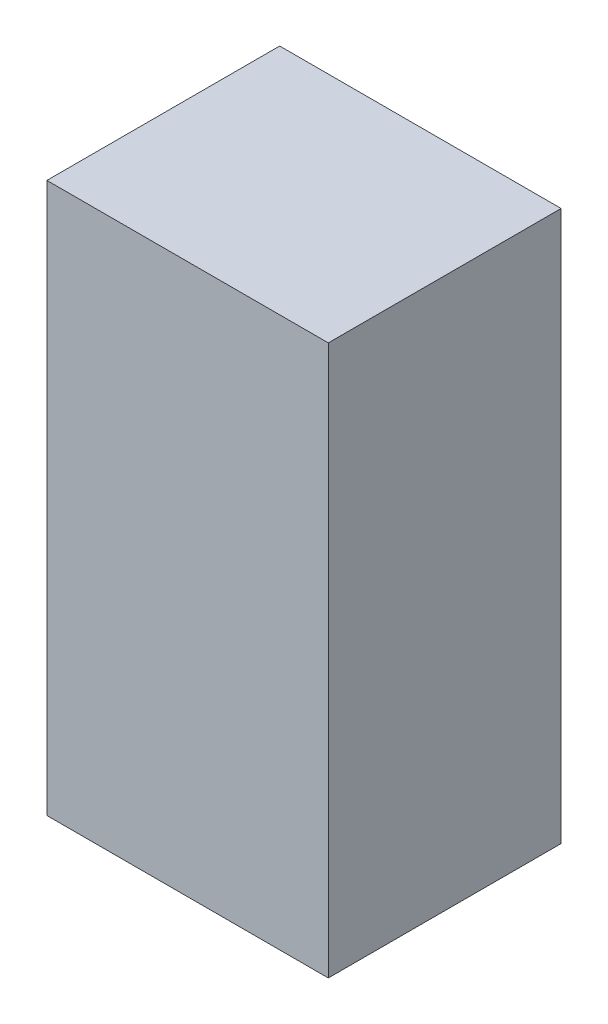
ISO-10303-21;
HEADER;
FILE_DESCRIPTION(('STEP AP214'),'2;1');
FILE_NAME('part.step','',(''),(''),'','','');
FILE_SCHEMA(('AUTOMOTIVE_DESIGN { 1 0 10303 214 1 1 1 1 }'));
ENDSEC;
DATA;
#1=APPLICATION_CONTEXT('core data for automotive mechanical design processes');
#2=APPLICATION_PROTOCOL_DEFINITION('international standard','automotive_design',2000,#1);
#3=PRODUCT_CONTEXT('',#1,'mechanical');
#4=PRODUCT('Part','Part','',(#3));
#5=PRODUCT_RELATED_PRODUCT_CATEGORY('part','',(#4));
#6=PRODUCT_DEFINITION_FORMATION('','',#4);
#7=PRODUCT_DEFINITION_CONTEXT('part definition',#1,'design');
#8=PRODUCT_DEFINITION('design','',#6,#7);
#9=PRODUCT_DEFINITION_SHAPE('','',#8);
#10=(LENGTH_UNIT() NAMED_UNIT(*) SI_UNIT(.MILLI.,.METRE.));
#11=(NAMED_UNIT(*) PLANE_ANGLE_UNIT() SI_UNIT($,.RADIAN.));
#12=(NAMED_UNIT(*) SI_UNIT($,.STERADIAN.) SOLID_ANGLE_UNIT());
#13=UNCERTAINTY_MEASURE_WITH_UNIT(LENGTH_MEASURE(1.E-05),#10,'distance_accuracy_value','');
#14=(GEOMETRIC_REPRESENTATION_CONTEXT(3) GLOBAL_UNCERTAINTY_ASSIGNED_CONTEXT((#13)) GLOBAL_UNIT_ASSIGNED_CONTEXT((#10,
#11,#12)) REPRESENTATION_CONTEXT('',''));
#15=CARTESIAN_POINT('',(0.,0.,0.));
#16=DIRECTION('',(0.,0.,1.));
#17=DIRECTION('',(1.,0.,0.));
#18=AXIS2_PLACEMENT_3D('',#15,#16,#17);
#19=CARTESIAN_POINT('',(0.,0.,18.2));
#20=DIRECTION('',(0.,0.,1.));
#21=DIRECTION('',(1.,0.,0.));
#22=AXIS2_PLACEMENT_3D('',#19,#20,#21);
#23=PLANE('',#22);
#24=DIRECTION('',(-1.,0.,0.));
#25=VECTOR('',#24,1.);
#26=CARTESIAN_POINT('',(0.,-21.5,18.2));
#27=LINE('',#26,#25);
#28=CARTESIAN_POINT('',(11.,-21.5,18.2));
#29=VERTEX_POINT('',#28);
#30=CARTESIAN_POINT('',(-11.,-21.5,18.2));
#31=VERTEX_POINT('',#30);
#32=EDGE_CURVE('E11',#29,#31,#27,.T.);
#33=ORIENTED_EDGE('',*,*,#32,.F.);
#34=DIRECTION('',(0.,-1.,0.));
#35=VECTOR('',#34,1.);
#36=CARTESIAN_POINT('',(11.,0.,18.2));
#37=LINE('',#36,#35);
#38=CARTESIAN_POINT('',(11.,21.5,18.2));
#39=VERTEX_POINT('',#38);
#40=EDGE_CURVE('E61',#39,#29,#37,.T.);
#41=ORIENTED_EDGE('',*,*,#40,.F.);
#42=DIRECTION('',(1.,0.,0.));
#43=VECTOR('',#42,1.);
#44=CARTESIAN_POINT('',(0.,21.5,18.2));
#45=LINE('',#44,#43);
#46=CARTESIAN_POINT('',(-11.,21.5,18.2));
#47=VERTEX_POINT('',#46);
#48=EDGE_CURVE('E87',#47,#39,#45,.T.);
#49=ORIENTED_EDGE('',*,*,#48,.F.);
#50=DIRECTION('',(0.,1.,0.));
#51=VECTOR('',#50,1.);
#52=CARTESIAN_POINT('',(-11.,0.,18.2));
#53=LINE('',#52,#51);
#54=EDGE_CURVE('E24',#31,#47,#53,.T.);
#55=ORIENTED_EDGE('',*,*,#54,.F.);
#56=EDGE_LOOP('',(#33,#41,#49,#55));
#57=FACE_BOUND('',#56,.T.);
#58=ADVANCED_FACE('F17',(#57),#23,.T.);
#59=CARTESIAN_POINT('',(0.,-21.5,0.));
#60=DIRECTION('',(0.,-1.,0.));
#61=DIRECTION('',(0.,0.,-1.));
#62=AXIS2_PLACEMENT_3D('',#59,#60,#61);
#63=PLANE('',#62);
#64=DIRECTION('',(0.,0.,1.));
#65=VECTOR('',#64,1.);
#66=CARTESIAN_POINT('',(11.,-21.5,0.));
#67=LINE('',#66,#65);
#68=CARTESIAN_POINT('',(11.,-21.5,0.));
#69=VERTEX_POINT('',#68);
#70=EDGE_CURVE('E53',#69,#29,#67,.T.);
#71=ORIENTED_EDGE('',*,*,#70,.T.);
#72=ORIENTED_EDGE('',*,*,#32,.T.);
#73=DIRECTION('',(0.,0.,1.));
#74=VECTOR('',#73,1.);
#75=CARTESIAN_POINT('',(-11.,-21.5,0.));
#76=LINE('',#75,#74);
#77=CARTESIAN_POINT('',(-11.,-21.5,0.));
#78=VERTEX_POINT('',#77);
#79=EDGE_CURVE('E70',#78,#31,#76,.T.);
#80=ORIENTED_EDGE('',*,*,#79,.F.);
#81=DIRECTION('',(1.,0.,0.));
#82=VECTOR('',#81,1.);
#83=CARTESIAN_POINT('',(0.,-21.5,0.));
#84=LINE('',#83,#82);
#85=EDGE_CURVE('E65',#78,#69,#84,.T.);
#86=ORIENTED_EDGE('',*,*,#85,.T.);
#87=EDGE_LOOP('',(#71,#72,#80,#86));
#88=FACE_BOUND('',#87,.T.);
#89=ADVANCED_FACE('F66',(#88),#63,.T.);
#90=CARTESIAN_POINT('',(-11.,0.,0.));
#91=DIRECTION('',(-1.,0.,0.));
#92=DIRECTION('',(0.,0.,1.));
#93=AXIS2_PLACEMENT_3D('',#90,#91,#92);
#94=PLANE('',#93);
#95=ORIENTED_EDGE('',*,*,#79,.T.);
#96=ORIENTED_EDGE('',*,*,#54,.T.);
#97=DIRECTION('',(0.,0.,1.));
#98=VECTOR('',#97,1.);
#99=CARTESIAN_POINT('',(-11.,21.5,0.));
#100=LINE('',#99,#98);
#101=CARTESIAN_POINT('',(-11.,21.5,0.));
#102=VERTEX_POINT('',#101);
#103=EDGE_CURVE('E85',#102,#47,#100,.T.);
#104=ORIENTED_EDGE('',*,*,#103,.F.);
#105=DIRECTION('',(0.,-1.,0.));
#106=VECTOR('',#105,1.);
#107=CARTESIAN_POINT('',(-11.,0.,0.));
#108=LINE('',#107,#106);
#109=EDGE_CURVE('E75',#102,#78,#108,.T.);
#110=ORIENTED_EDGE('',*,*,#109,.T.);
#111=EDGE_LOOP('',(#95,#96,#104,#110));
#112=FACE_BOUND('',#111,.T.);
#113=ADVANCED_FACE('F93',(#112),#94,.T.);
#114=CARTESIAN_POINT('',(0.,21.5,0.));
#115=DIRECTION('',(0.,1.,0.));
#116=DIRECTION('',(0.,0.,1.));
#117=AXIS2_PLACEMENT_3D('',#114,#115,#116);
#118=PLANE('',#117);
#119=ORIENTED_EDGE('',*,*,#103,.T.);
#120=ORIENTED_EDGE('',*,*,#48,.T.);
#121=DIRECTION('',(0.,0.,1.));
#122=VECTOR('',#121,1.);
#123=CARTESIAN_POINT('',(11.,21.5,0.));
#124=LINE('',#123,#122);
#125=CARTESIAN_POINT('',(11.,21.5,0.));
#126=VERTEX_POINT('',#125);
#127=EDGE_CURVE('E62',#126,#39,#124,.T.);
#128=ORIENTED_EDGE('',*,*,#127,.F.);
#129=DIRECTION('',(-1.,0.,0.));
#130=VECTOR('',#129,1.);
#131=CARTESIAN_POINT('',(0.,21.5,0.));
#132=LINE('',#131,#130);
#133=EDGE_CURVE('E76',#126,#102,#132,.T.);
#134=ORIENTED_EDGE('',*,*,#133,.T.);
#135=EDGE_LOOP('',(#119,#120,#128,#134));
#136=FACE_BOUND('',#135,.T.);
#137=ADVANCED_FACE('F90',(#136),#118,.T.);
#138=CARTESIAN_POINT('',(0.,0.,0.));
#139=DIRECTION('',(0.,0.,-1.));
#140=DIRECTION('',(-1.,0.,0.));
#141=AXIS2_PLACEMENT_3D('',#138,#139,#140);
#142=PLANE('',#141);
#143=DIRECTION('',(0.,1.,0.));
#144=VECTOR('',#143,1.);
#145=CARTESIAN_POINT('',(11.,0.,0.));
#146=LINE('',#145,#144);
#147=EDGE_CURVE('E56',#69,#126,#146,.T.);
#148=ORIENTED_EDGE('',*,*,#147,.F.);
#149=ORIENTED_EDGE('',*,*,#85,.F.);
#150=ORIENTED_EDGE('',*,*,#109,.F.);
#151=ORIENTED_EDGE('',*,*,#133,.F.);
#152=EDGE_LOOP('',(#148,#149,#150,#151));
#153=FACE_BOUND('',#152,.T.);
#154=ADVANCED_FACE('F72',(#153),#142,.T.);
#155=CARTESIAN_POINT('',(11.,0.,0.));
#156=DIRECTION('',(1.,0.,0.));
#157=DIRECTION('',(0.,0.,-1.));
#158=AXIS2_PLACEMENT_3D('',#155,#156,#157);
#159=PLANE('',#158);
#160=ORIENTED_EDGE('',*,*,#147,.T.);
#161=ORIENTED_EDGE('',*,*,#127,.T.);
#162=ORIENTED_EDGE('',*,*,#40,.T.);
#163=ORIENTED_EDGE('',*,*,#70,.F.);
#164=EDGE_LOOP('',(#160,#161,#162,#163));
#165=FACE_BOUND('',#164,.T.);
#166=ADVANCED_FACE('F57',(#165),#159,.T.);
#167=CLOSED_SHELL('',(#58,#89,#113,#137,#154,#166));
#168=MANIFOLD_SOLID_BREP('B1',#167);
#169=ADVANCED_BREP_SHAPE_REPRESENTATION('',(#18,#168),#14);
#170=SHAPE_DEFINITION_REPRESENTATION(#9,#169);
ENDSEC;
END-ISO-10303-21;
